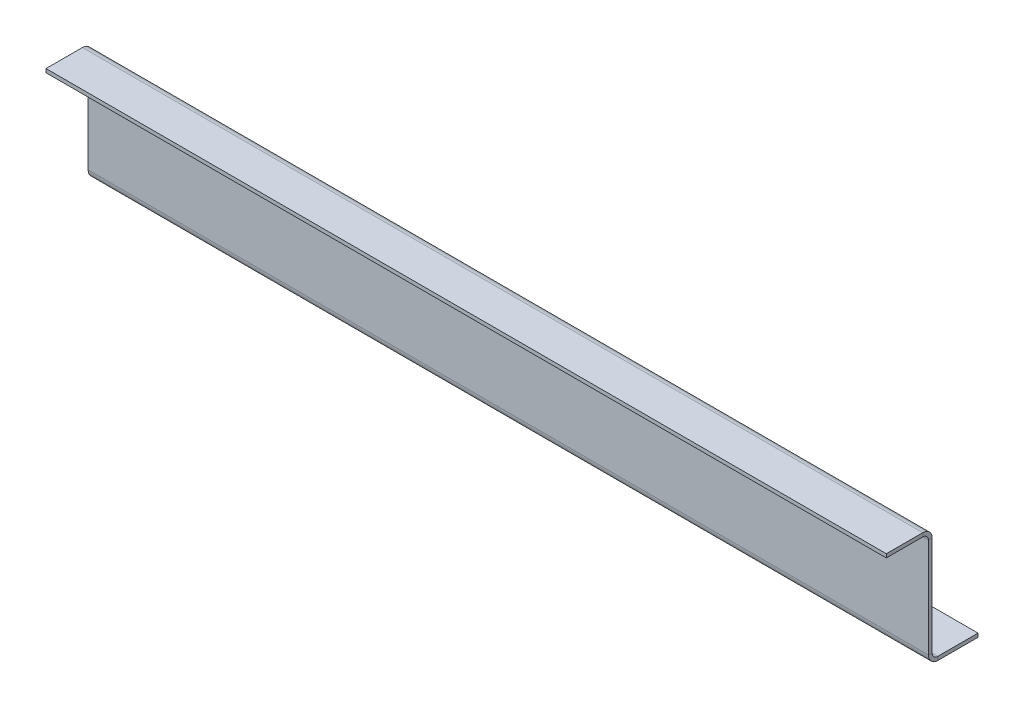
ISO-10303-21;
HEADER;
FILE_DESCRIPTION(('STEP AP214'),'2;1');
FILE_NAME('part.step','',(''),(''),'','','');
FILE_SCHEMA(('AUTOMOTIVE_DESIGN { 1 0 10303 214 1 1 1 1 }'));
ENDSEC;
DATA;
#1=APPLICATION_CONTEXT('core data for automotive mechanical design processes');
#2=APPLICATION_PROTOCOL_DEFINITION('international standard','automotive_design',2000,#1);
#3=PRODUCT_CONTEXT('',#1,'mechanical');
#4=PRODUCT('Part','Part','',(#3));
#5=PRODUCT_RELATED_PRODUCT_CATEGORY('part','',(#4));
#6=PRODUCT_DEFINITION_FORMATION('','',#4);
#7=PRODUCT_DEFINITION_CONTEXT('part definition',#1,'design');
#8=PRODUCT_DEFINITION('design','',#6,#7);
#9=PRODUCT_DEFINITION_SHAPE('','',#8);
#10=(LENGTH_UNIT() NAMED_UNIT(*) SI_UNIT(.MILLI.,.METRE.));
#11=(NAMED_UNIT(*) PLANE_ANGLE_UNIT() SI_UNIT($,.RADIAN.));
#12=(NAMED_UNIT(*) SI_UNIT($,.STERADIAN.) SOLID_ANGLE_UNIT());
#13=UNCERTAINTY_MEASURE_WITH_UNIT(LENGTH_MEASURE(1.E-05),#10,'distance_accuracy_value','');
#14=(GEOMETRIC_REPRESENTATION_CONTEXT(3) GLOBAL_UNCERTAINTY_ASSIGNED_CONTEXT((#13)) GLOBAL_UNIT_ASSIGNED_CONTEXT((#10,
#11,#12)) REPRESENTATION_CONTEXT('',''));
#15=CARTESIAN_POINT('',(0.,0.,0.));
#16=DIRECTION('',(0.,0.,1.));
#17=DIRECTION('',(1.,0.,0.));
#18=AXIS2_PLACEMENT_3D('',#15,#16,#17);
#19=CARTESIAN_POINT('',(279.4,23.0449549544025,0.));
#20=DIRECTION('',(1.,0.,0.));
#21=DIRECTION('',(0.,0.,-1.));
#22=AXIS2_PLACEMENT_3D('',#19,#20,#21);
#23=PLANE('',#22);
#24=DIRECTION('',(0.,0.,1.));
#25=VECTOR('',#24,1.);
#26=CARTESIAN_POINT('',(279.4,23.0449549544025,0.));
#27=LINE('',#26,#25);
#28=CARTESIAN_POINT('',(279.4,23.0449549544025,0.));
#29=VERTEX_POINT('',#28);
#30=CARTESIAN_POINT('',(279.4,23.0449549544025,1.2192));
#31=VERTEX_POINT('',#30);
#32=EDGE_CURVE('E11',#29,#31,#27,.T.);
#33=ORIENTED_EDGE('',*,*,#32,.F.);
#34=CARTESIAN_POINT('',(279.4,23.0449549544025,3.1242));
#35=DIRECTION('',(1.,0.,0.));
#36=DIRECTION('',(0.,0.,-1.));
#37=AXIS2_PLACEMENT_3D('',#34,#35,#36);
#38=CIRCLE('',#37,3.1242);
#39=CARTESIAN_POINT('',(279.4,26.1691549544025,3.12420000000001));
#40=VERTEX_POINT('',#39);
#41=EDGE_CURVE('E249',#40,#29,#38,.F.);
#42=ORIENTED_EDGE('',*,*,#41,.F.);
#43=DIRECTION('',(0.,1.,0.));
#44=VECTOR('',#43,1.);
#45=CARTESIAN_POINT('',(279.4,24.9499549544025,3.12420000000001));
#46=LINE('',#45,#44);
#47=CARTESIAN_POINT('',(279.4,24.9499549544025,3.12420000000001));
#48=VERTEX_POINT('',#47);
#49=EDGE_CURVE('E47',#48,#40,#46,.T.);
#50=ORIENTED_EDGE('',*,*,#49,.F.);
#51=CARTESIAN_POINT('',(279.4,23.0449549544025,3.1242));
#52=DIRECTION('',(1.,0.,0.));
#53=DIRECTION('',(0.,0.,-1.));
#54=AXIS2_PLACEMENT_3D('',#51,#52,#53);
#55=CIRCLE('',#54,1.905);
#56=EDGE_CURVE('E148',#48,#31,#55,.F.);
#57=ORIENTED_EDGE('',*,*,#56,.T.);
#58=EDGE_LOOP('',(#33,#42,#50,#57));
#59=FACE_BOUND('',#58,.T.);
#60=ADVANCED_FACE('F39',(#59),#23,.T.);
#61=CARTESIAN_POINT('',(279.4,24.9499549544025,3.12420000000001));
#62=DIRECTION('',(1.,0.,0.));
#63=DIRECTION('',(0.,0.,-1.));
#64=AXIS2_PLACEMENT_3D('',#61,#62,#63);
#65=PLANE('',#64);
#66=DIRECTION('',(0.,-1.,0.));
#67=VECTOR('',#66,1.);
#68=CARTESIAN_POINT('',(279.4,26.1691549544025,0.));
#69=LINE('',#68,#67);
#70=CARTESIAN_POINT('',(279.4,-10.0258450455975,0.));
#71=VERTEX_POINT('',#70);
#72=EDGE_CURVE('E142',#29,#71,#69,.T.);
#73=ORIENTED_EDGE('',*,*,#72,.F.);
#74=ORIENTED_EDGE('',*,*,#32,.T.);
#75=DIRECTION('',(0.,-1.,0.));
#76=VECTOR('',#75,1.);
#77=CARTESIAN_POINT('',(279.4,26.1691549544025,1.2192));
#78=LINE('',#77,#76);
#79=CARTESIAN_POINT('',(279.4,-10.0258450455974,1.2192));
#80=VERTEX_POINT('',#79);
#81=EDGE_CURVE('E139',#31,#80,#78,.T.);
#82=ORIENTED_EDGE('',*,*,#81,.T.);
#83=DIRECTION('',(0.,0.,-1.));
#84=VECTOR('',#83,1.);
#85=CARTESIAN_POINT('',(279.4,-10.0258450455974,1.2192));
#86=LINE('',#85,#84);
#87=EDGE_CURVE('E230',#80,#71,#86,.T.);
#88=ORIENTED_EDGE('',*,*,#87,.T.);
#89=EDGE_LOOP('',(#73,#74,#82,#88));
#90=FACE_BOUND('',#89,.T.);
#91=ADVANCED_FACE('F137',(#90),#65,.T.);
#92=CARTESIAN_POINT('',(0.,26.1691549544025,3.12420000000001));
#93=DIRECTION('',(-1.,0.,0.));
#94=DIRECTION('',(0.,0.,1.));
#95=AXIS2_PLACEMENT_3D('',#92,#93,#94);
#96=PLANE('',#95);
#97=DIRECTION('',(0.,-1.,0.));
#98=VECTOR('',#97,1.);
#99=CARTESIAN_POINT('',(0.,26.1691549544025,3.12420000000001));
#100=LINE('',#99,#98);
#101=CARTESIAN_POINT('',(0.,26.1691549544025,3.12420000000001));
#102=VERTEX_POINT('',#101);
#103=CARTESIAN_POINT('',(0.,24.9499549544025,3.12420000000001));
#104=VERTEX_POINT('',#103);
#105=EDGE_CURVE('E235',#102,#104,#100,.T.);
#106=ORIENTED_EDGE('',*,*,#105,.F.);
#107=CARTESIAN_POINT('',(0.,23.0449549544025,3.1242));
#108=DIRECTION('',(1.,0.,0.));
#109=DIRECTION('',(0.,0.,-1.));
#110=AXIS2_PLACEMENT_3D('',#107,#108,#109);
#111=CIRCLE('',#110,3.1242);
#112=CARTESIAN_POINT('',(0.,23.0449549544025,0.));
#113=VERTEX_POINT('',#112);
#114=EDGE_CURVE('E187',#102,#113,#111,.F.);
#115=ORIENTED_EDGE('',*,*,#114,.T.);
#116=DIRECTION('',(0.,0.,-1.));
#117=VECTOR('',#116,1.);
#118=CARTESIAN_POINT('',(0.,23.0449549544025,1.2192));
#119=LINE('',#118,#117);
#120=CARTESIAN_POINT('',(0.,23.0449549544025,1.2192));
#121=VERTEX_POINT('',#120);
#122=EDGE_CURVE('E233',#121,#113,#119,.T.);
#123=ORIENTED_EDGE('',*,*,#122,.F.);
#124=CARTESIAN_POINT('',(0.,23.0449549544025,3.1242));
#125=DIRECTION('',(1.,0.,0.));
#126=DIRECTION('',(0.,0.,-1.));
#127=AXIS2_PLACEMENT_3D('',#124,#125,#126);
#128=CIRCLE('',#127,1.905);
#129=EDGE_CURVE('E160',#104,#121,#128,.F.);
#130=ORIENTED_EDGE('',*,*,#129,.F.);
#131=EDGE_LOOP('',(#106,#115,#123,#130));
#132=FACE_BOUND('',#131,.T.);
#133=ADVANCED_FACE('F287',(#132),#96,.T.);
#134=CARTESIAN_POINT('',(0.,23.0449549544025,1.2192));
#135=DIRECTION('',(-1.,0.,0.));
#136=DIRECTION('',(0.,0.,1.));
#137=AXIS2_PLACEMENT_3D('',#134,#135,#136);
#138=PLANE('',#137);
#139=DIRECTION('',(0.,0.,-1.));
#140=VECTOR('',#139,1.);
#141=CARTESIAN_POINT('',(0.,26.1691549544025,15.24));
#142=LINE('',#141,#140);
#143=CARTESIAN_POINT('',(0.,26.1691549544025,15.24));
#144=VERTEX_POINT('',#143);
#145=EDGE_CURVE('E190',#144,#102,#142,.T.);
#146=ORIENTED_EDGE('',*,*,#145,.T.);
#147=ORIENTED_EDGE('',*,*,#105,.T.);
#148=DIRECTION('',(0.,0.,-1.));
#149=VECTOR('',#148,1.);
#150=CARTESIAN_POINT('',(0.,24.9499549544025,15.24));
#151=LINE('',#150,#149);
#152=CARTESIAN_POINT('',(0.,24.9499549544025,15.24));
#153=VERTEX_POINT('',#152);
#154=EDGE_CURVE('E196',#153,#104,#151,.T.);
#155=ORIENTED_EDGE('',*,*,#154,.F.);
#156=DIRECTION('',(0.,1.,0.));
#157=VECTOR('',#156,1.);
#158=CARTESIAN_POINT('',(0.,24.9499549544025,15.24));
#159=LINE('',#158,#157);
#160=EDGE_CURVE('E193',#153,#144,#159,.T.);
#161=ORIENTED_EDGE('',*,*,#160,.T.);
#162=EDGE_LOOP('',(#146,#147,#155,#161));
#163=FACE_BOUND('',#162,.T.);
#164=ADVANCED_FACE('F290',(#163),#138,.T.);
#165=CARTESIAN_POINT('',(279.4,-11.9308450455975,-1.905));
#166=DIRECTION('',(1.,0.,0.));
#167=DIRECTION('',(0.,0.,-1.));
#168=AXIS2_PLACEMENT_3D('',#165,#166,#167);
#169=PLANE('',#168);
#170=DIRECTION('',(0.,-1.,0.));
#171=VECTOR('',#170,1.);
#172=CARTESIAN_POINT('',(279.4,-11.9308450455975,-1.905));
#173=LINE('',#172,#171);
#174=CARTESIAN_POINT('',(279.4,-11.9308450455975,-1.905));
#175=VERTEX_POINT('',#174);
#176=CARTESIAN_POINT('',(279.4,-13.1500450455975,-1.905));
#177=VERTEX_POINT('',#176);
#178=EDGE_CURVE('E55',#175,#177,#173,.T.);
#179=ORIENTED_EDGE('',*,*,#178,.F.);
#180=CARTESIAN_POINT('',(279.4,-10.0258450455975,-1.905));
#181=DIRECTION('',(-1.,0.,0.));
#182=DIRECTION('',(0.,0.,1.));
#183=AXIS2_PLACEMENT_3D('',#180,#181,#182);
#184=CIRCLE('',#183,1.905);
#185=EDGE_CURVE('E259',#71,#175,#184,.F.);
#186=ORIENTED_EDGE('',*,*,#185,.F.);
#187=ORIENTED_EDGE('',*,*,#87,.F.);
#188=CARTESIAN_POINT('',(279.4,-10.0258450455975,-1.905));
#189=DIRECTION('',(1.,0.,0.));
#190=DIRECTION('',(0.,0.,-1.));
#191=AXIS2_PLACEMENT_3D('',#188,#189,#190);
#192=CIRCLE('',#191,3.1242);
#193=EDGE_CURVE('E168',#80,#177,#192,.T.);
#194=ORIENTED_EDGE('',*,*,#193,.T.);
#195=EDGE_LOOP('',(#179,#186,#187,#194));
#196=FACE_BOUND('',#195,.T.);
#197=ADVANCED_FACE('F282',(#196),#169,.T.);
#198=CARTESIAN_POINT('',(279.4,-10.0258450455974,1.2192));
#199=DIRECTION('',(1.,0.,0.));
#200=DIRECTION('',(0.,0.,-1.));
#201=AXIS2_PLACEMENT_3D('',#198,#199,#200);
#202=PLANE('',#201);
#203=DIRECTION('',(0.,0.,-1.));
#204=VECTOR('',#203,1.);
#205=CARTESIAN_POINT('',(279.4,-11.9308450455975,0.));
#206=LINE('',#205,#204);
#207=CARTESIAN_POINT('',(279.4,-11.9308450455975,-15.24));
#208=VERTEX_POINT('',#207);
#209=EDGE_CURVE('E262',#175,#208,#206,.T.);
#210=ORIENTED_EDGE('',*,*,#209,.F.);
#211=ORIENTED_EDGE('',*,*,#178,.T.);
#212=DIRECTION('',(0.,0.,-1.));
#213=VECTOR('',#212,1.);
#214=CARTESIAN_POINT('',(279.4,-13.1500450455975,0.));
#215=LINE('',#214,#213);
#216=CARTESIAN_POINT('',(279.4,-13.1500450455975,-15.24));
#217=VERTEX_POINT('',#216);
#218=EDGE_CURVE('E109',#177,#217,#215,.T.);
#219=ORIENTED_EDGE('',*,*,#218,.T.);
#220=DIRECTION('',(0.,-1.,0.));
#221=VECTOR('',#220,1.);
#222=CARTESIAN_POINT('',(279.4,-11.9308450455975,-15.24));
#223=LINE('',#222,#221);
#224=EDGE_CURVE('E265',#208,#217,#223,.T.);
#225=ORIENTED_EDGE('',*,*,#224,.F.);
#226=EDGE_LOOP('',(#210,#211,#219,#225));
#227=FACE_BOUND('',#226,.T.);
#228=ADVANCED_FACE('F271',(#227),#202,.T.);
#229=CARTESIAN_POINT('',(0.,-10.0258450455975,0.));
#230=DIRECTION('',(-1.,0.,0.));
#231=DIRECTION('',(0.,0.,1.));
#232=AXIS2_PLACEMENT_3D('',#229,#230,#231);
#233=PLANE('',#232);
#234=DIRECTION('',(0.,0.,1.));
#235=VECTOR('',#234,1.);
#236=CARTESIAN_POINT('',(0.,-10.0258450455975,0.));
#237=LINE('',#236,#235);
#238=CARTESIAN_POINT('',(0.,-10.0258450455975,0.));
#239=VERTEX_POINT('',#238);
#240=CARTESIAN_POINT('',(0.,-10.0258450455974,1.2192));
#241=VERTEX_POINT('',#240);
#242=EDGE_CURVE('E96',#239,#241,#237,.T.);
#243=ORIENTED_EDGE('',*,*,#242,.F.);
#244=CARTESIAN_POINT('',(0.,-10.0258450455975,-1.905));
#245=DIRECTION('',(-1.,0.,0.));
#246=DIRECTION('',(0.,0.,1.));
#247=AXIS2_PLACEMENT_3D('',#244,#245,#246);
#248=CIRCLE('',#247,1.905);
#249=CARTESIAN_POINT('',(0.,-11.9308450455975,-1.905));
#250=VERTEX_POINT('',#249);
#251=EDGE_CURVE('E183',#239,#250,#248,.F.);
#252=ORIENTED_EDGE('',*,*,#251,.T.);
#253=DIRECTION('',(0.,1.,0.));
#254=VECTOR('',#253,1.);
#255=CARTESIAN_POINT('',(0.,-13.1500450455975,-1.905));
#256=LINE('',#255,#254);
#257=CARTESIAN_POINT('',(0.,-13.1500450455975,-1.905));
#258=VERTEX_POINT('',#257);
#259=EDGE_CURVE('E103',#258,#250,#256,.T.);
#260=ORIENTED_EDGE('',*,*,#259,.F.);
#261=CARTESIAN_POINT('',(0.,-10.0258450455975,-1.905));
#262=DIRECTION('',(1.,0.,0.));
#263=DIRECTION('',(0.,0.,-1.));
#264=AXIS2_PLACEMENT_3D('',#261,#262,#263);
#265=CIRCLE('',#264,3.1242);
#266=EDGE_CURVE('E202',#241,#258,#265,.T.);
#267=ORIENTED_EDGE('',*,*,#266,.F.);
#268=EDGE_LOOP('',(#243,#252,#260,#267));
#269=FACE_BOUND('',#268,.T.);
#270=ADVANCED_FACE('F319',(#269),#233,.T.);
#271=CARTESIAN_POINT('',(0.,-13.1500450455975,-1.905));
#272=DIRECTION('',(-1.,0.,0.));
#273=DIRECTION('',(0.,0.,1.));
#274=AXIS2_PLACEMENT_3D('',#271,#272,#273);
#275=PLANE('',#274);
#276=DIRECTION('',(0.,-1.,0.));
#277=VECTOR('',#276,1.);
#278=CARTESIAN_POINT('',(0.,26.1691549544025,0.));
#279=LINE('',#278,#277);
#280=EDGE_CURVE('E185',#113,#239,#279,.T.);
#281=ORIENTED_EDGE('',*,*,#280,.T.);
#282=ORIENTED_EDGE('',*,*,#242,.T.);
#283=DIRECTION('',(0.,-1.,0.));
#284=VECTOR('',#283,1.);
#285=CARTESIAN_POINT('',(0.,26.1691549544025,1.2192));
#286=LINE('',#285,#284);
#287=EDGE_CURVE('E200',#121,#241,#286,.T.);
#288=ORIENTED_EDGE('',*,*,#287,.F.);
#289=ORIENTED_EDGE('',*,*,#122,.T.);
#290=EDGE_LOOP('',(#281,#282,#288,#289));
#291=FACE_BOUND('',#290,.T.);
#292=ADVANCED_FACE('F322',(#291),#275,.T.);
#293=CARTESIAN_POINT('',(279.4,-13.1500450455975,0.));
#294=DIRECTION('',(0.,1.,0.));
#295=DIRECTION('',(0.,0.,1.));
#296=AXIS2_PLACEMENT_3D('',#293,#294,#295);
#297=PLANE('',#296);
#298=DIRECTION('',(0.,0.,-1.));
#299=VECTOR('',#298,1.);
#300=CARTESIAN_POINT('',(0.,-13.1500450455975,0.));
#301=LINE('',#300,#299);
#302=CARTESIAN_POINT('',(0.,-13.1500450455975,-15.24));
#303=VERTEX_POINT('',#302);
#304=EDGE_CURVE('E174',#258,#303,#301,.T.);
#305=ORIENTED_EDGE('',*,*,#304,.T.);
#306=DIRECTION('',(-1.,0.,0.));
#307=VECTOR('',#306,1.);
#308=CARTESIAN_POINT('',(279.4,-13.1500450455975,-15.24));
#309=LINE('',#308,#307);
#310=EDGE_CURVE('E226',#217,#303,#309,.T.);
#311=ORIENTED_EDGE('',*,*,#310,.F.);
#312=ORIENTED_EDGE('',*,*,#218,.F.);
#313=DIRECTION('',(-1.,0.,0.));
#314=VECTOR('',#313,1.);
#315=CARTESIAN_POINT('',(279.4,-13.1500450455975,-1.905));
#316=LINE('',#315,#314);
#317=EDGE_CURVE('E170',#177,#258,#316,.T.);
#318=ORIENTED_EDGE('',*,*,#317,.T.);
#319=EDGE_LOOP('',(#305,#311,#312,#318));
#320=FACE_BOUND('',#319,.T.);
#321=ADVANCED_FACE('F325',(#320),#297,.F.);
#322=CARTESIAN_POINT('',(279.4,-11.9308450455975,-15.24));
#323=DIRECTION('',(0.,0.,-1.));
#324=DIRECTION('',(-1.,0.,0.));
#325=AXIS2_PLACEMENT_3D('',#322,#323,#324);
#326=PLANE('',#325);
#327=DIRECTION('',(0.,-1.,0.));
#328=VECTOR('',#327,1.);
#329=CARTESIAN_POINT('',(0.,-11.9308450455975,-15.24));
#330=LINE('',#329,#328);
#331=CARTESIAN_POINT('',(0.,-11.9308450455975,-15.24));
#332=VERTEX_POINT('',#331);
#333=EDGE_CURVE('E177',#332,#303,#330,.T.);
#334=ORIENTED_EDGE('',*,*,#333,.F.);
#335=DIRECTION('',(-1.,0.,0.));
#336=VECTOR('',#335,1.);
#337=CARTESIAN_POINT('',(279.4,-11.9308450455975,-15.24));
#338=LINE('',#337,#336);
#339=EDGE_CURVE('E224',#208,#332,#338,.T.);
#340=ORIENTED_EDGE('',*,*,#339,.F.);
#341=ORIENTED_EDGE('',*,*,#224,.T.);
#342=ORIENTED_EDGE('',*,*,#310,.T.);
#343=EDGE_LOOP('',(#334,#340,#341,#342));
#344=FACE_BOUND('',#343,.T.);
#345=ADVANCED_FACE('F270',(#344),#326,.T.);
#346=CARTESIAN_POINT('',(279.4,-11.9308450455975,0.));
#347=DIRECTION('',(0.,1.,0.));
#348=DIRECTION('',(0.,0.,1.));
#349=AXIS2_PLACEMENT_3D('',#346,#347,#348);
#350=PLANE('',#349);
#351=DIRECTION('',(0.,0.,-1.));
#352=VECTOR('',#351,1.);
#353=CARTESIAN_POINT('',(0.,-11.9308450455975,0.));
#354=LINE('',#353,#352);
#355=EDGE_CURVE('E180',#250,#332,#354,.T.);
#356=ORIENTED_EDGE('',*,*,#355,.F.);
#357=DIRECTION('',(-1.,0.,0.));
#358=VECTOR('',#357,1.);
#359=CARTESIAN_POINT('',(279.4,-11.9308450455975,-1.905));
#360=LINE('',#359,#358);
#361=EDGE_CURVE('E221',#175,#250,#360,.T.);
#362=ORIENTED_EDGE('',*,*,#361,.F.);
#363=ORIENTED_EDGE('',*,*,#209,.T.);
#364=ORIENTED_EDGE('',*,*,#339,.T.);
#365=EDGE_LOOP('',(#356,#362,#363,#364));
#366=FACE_BOUND('',#365,.T.);
#367=ADVANCED_FACE('F275',(#366),#350,.T.);
#368=CARTESIAN_POINT('',(279.4,-10.0258450455975,-1.905));
#369=DIRECTION('',(-1.,0.,0.));
#370=DIRECTION('',(0.,0.,1.));
#371=AXIS2_PLACEMENT_3D('',#368,#369,#370);
#372=CYLINDRICAL_SURFACE('',#371,1.905);
#373=ORIENTED_EDGE('',*,*,#251,.F.);
#374=DIRECTION('',(-1.,0.,0.));
#375=VECTOR('',#374,1.);
#376=CARTESIAN_POINT('',(279.4,-10.0258450455975,0.));
#377=LINE('',#376,#375);
#378=EDGE_CURVE('E218',#71,#239,#377,.T.);
#379=ORIENTED_EDGE('',*,*,#378,.F.);
#380=ORIENTED_EDGE('',*,*,#185,.T.);
#381=ORIENTED_EDGE('',*,*,#361,.T.);
#382=EDGE_LOOP('',(#373,#379,#380,#381));
#383=FACE_BOUND('',#382,.T.);
#384=ADVANCED_FACE('F278',(#383),#372,.F.);
#385=CARTESIAN_POINT('',(279.4,26.1691549544025,0.));
#386=DIRECTION('',(0.,0.,-1.));
#387=DIRECTION('',(0.,1.,0.));
#388=AXIS2_PLACEMENT_3D('',#385,#386,#387);
#389=PLANE('',#388);
#390=ORIENTED_EDGE('',*,*,#280,.F.);
#391=DIRECTION('',(-1.,0.,0.));
#392=VECTOR('',#391,1.);
#393=CARTESIAN_POINT('',(279.4,23.0449549544025,0.));
#394=LINE('',#393,#392);
#395=EDGE_CURVE('E215',#29,#113,#394,.T.);
#396=ORIENTED_EDGE('',*,*,#395,.F.);
#397=ORIENTED_EDGE('',*,*,#72,.T.);
#398=ORIENTED_EDGE('',*,*,#378,.T.);
#399=EDGE_LOOP('',(#390,#396,#397,#398));
#400=FACE_BOUND('',#399,.T.);
#401=ADVANCED_FACE('F285',(#400),#389,.T.);
#402=CARTESIAN_POINT('',(279.4,23.0449549544025,3.1242));
#403=DIRECTION('',(-1.,0.,0.));
#404=DIRECTION('',(0.,0.,1.));
#405=AXIS2_PLACEMENT_3D('',#402,#403,#404);
#406=CYLINDRICAL_SURFACE('',#405,3.1242);
#407=ORIENTED_EDGE('',*,*,#114,.F.);
#408=DIRECTION('',(-1.,0.,0.));
#409=VECTOR('',#408,1.);
#410=CARTESIAN_POINT('',(279.4,26.1691549544025,3.12420000000001));
#411=LINE('',#410,#409);
#412=EDGE_CURVE('E212',#40,#102,#411,.T.);
#413=ORIENTED_EDGE('',*,*,#412,.F.);
#414=ORIENTED_EDGE('',*,*,#41,.T.);
#415=ORIENTED_EDGE('',*,*,#395,.T.);
#416=EDGE_LOOP('',(#407,#413,#414,#415));
#417=FACE_BOUND('',#416,.T.);
#418=ADVANCED_FACE('F248',(#417),#406,.T.);
#419=CARTESIAN_POINT('',(279.4,26.1691549544025,15.24));
#420=DIRECTION('',(0.,1.,0.));
#421=DIRECTION('',(0.,0.,1.));
#422=AXIS2_PLACEMENT_3D('',#419,#420,#421);
#423=PLANE('',#422);
#424=ORIENTED_EDGE('',*,*,#145,.F.);
#425=DIRECTION('',(-1.,0.,0.));
#426=VECTOR('',#425,1.);
#427=CARTESIAN_POINT('',(279.4,26.1691549544025,15.24));
#428=LINE('',#427,#426);
#429=CARTESIAN_POINT('',(279.4,26.1691549544025,15.24));
#430=VERTEX_POINT('',#429);
#431=EDGE_CURVE('E210',#430,#144,#428,.T.);
#432=ORIENTED_EDGE('',*,*,#431,.F.);
#433=DIRECTION('',(0.,0.,-1.));
#434=VECTOR('',#433,1.);
#435=CARTESIAN_POINT('',(279.4,26.1691549544025,15.24));
#436=LINE('',#435,#434);
#437=EDGE_CURVE('E242',#430,#40,#436,.T.);
#438=ORIENTED_EDGE('',*,*,#437,.T.);
#439=ORIENTED_EDGE('',*,*,#412,.T.);
#440=EDGE_LOOP('',(#424,#432,#438,#439));
#441=FACE_BOUND('',#440,.T.);
#442=ADVANCED_FACE('F253',(#441),#423,.T.);
#443=CARTESIAN_POINT('',(279.4,24.9499549544025,15.24));
#444=DIRECTION('',(0.,0.,1.));
#445=DIRECTION('',(1.,0.,0.));
#446=AXIS2_PLACEMENT_3D('',#443,#444,#445);
#447=PLANE('',#446);
#448=ORIENTED_EDGE('',*,*,#160,.F.);
#449=DIRECTION('',(-1.,0.,0.));
#450=VECTOR('',#449,1.);
#451=CARTESIAN_POINT('',(279.4,24.9499549544025,15.24));
#452=LINE('',#451,#450);
#453=CARTESIAN_POINT('',(279.4,24.9499549544025,15.24));
#454=VERTEX_POINT('',#453);
#455=EDGE_CURVE('E208',#454,#153,#452,.T.);
#456=ORIENTED_EDGE('',*,*,#455,.F.);
#457=DIRECTION('',(0.,1.,0.));
#458=VECTOR('',#457,1.);
#459=CARTESIAN_POINT('',(279.4,24.9499549544025,15.24));
#460=LINE('',#459,#458);
#461=EDGE_CURVE('E254',#454,#430,#460,.T.);
#462=ORIENTED_EDGE('',*,*,#461,.T.);
#463=ORIENTED_EDGE('',*,*,#431,.T.);
#464=EDGE_LOOP('',(#448,#456,#462,#463));
#465=FACE_BOUND('',#464,.T.);
#466=ADVANCED_FACE('F295',(#465),#447,.T.);
#467=CARTESIAN_POINT('',(279.4,24.9499549544025,15.24));
#468=DIRECTION('',(0.,1.,0.));
#469=DIRECTION('',(0.,0.,1.));
#470=AXIS2_PLACEMENT_3D('',#467,#468,#469);
#471=PLANE('',#470);
#472=ORIENTED_EDGE('',*,*,#154,.T.);
#473=DIRECTION('',(-1.,0.,0.));
#474=VECTOR('',#473,1.);
#475=CARTESIAN_POINT('',(279.4,24.9499549544025,3.12420000000001));
#476=LINE('',#475,#474);
#477=EDGE_CURVE('E162',#48,#104,#476,.T.);
#478=ORIENTED_EDGE('',*,*,#477,.F.);
#479=DIRECTION('',(0.,0.,-1.));
#480=VECTOR('',#479,1.);
#481=CARTESIAN_POINT('',(279.4,24.9499549544025,15.24));
#482=LINE('',#481,#480);
#483=EDGE_CURVE('E153',#454,#48,#482,.T.);
#484=ORIENTED_EDGE('',*,*,#483,.F.);
#485=ORIENTED_EDGE('',*,*,#455,.T.);
#486=EDGE_LOOP('',(#472,#478,#484,#485));
#487=FACE_BOUND('',#486,.T.);
#488=ADVANCED_FACE('F293',(#487),#471,.F.);
#489=CARTESIAN_POINT('',(279.4,23.0449549544025,3.1242));
#490=DIRECTION('',(-1.,0.,0.));
#491=DIRECTION('',(0.,0.,1.));
#492=AXIS2_PLACEMENT_3D('',#489,#490,#491);
#493=CYLINDRICAL_SURFACE('',#492,1.905);
#494=ORIENTED_EDGE('',*,*,#129,.T.);
#495=DIRECTION('',(-1.,0.,0.));
#496=VECTOR('',#495,1.);
#497=CARTESIAN_POINT('',(279.4,23.0449549544025,1.2192));
#498=LINE('',#497,#496);
#499=EDGE_CURVE('E157',#31,#121,#498,.T.);
#500=ORIENTED_EDGE('',*,*,#499,.F.);
#501=ORIENTED_EDGE('',*,*,#56,.F.);
#502=ORIENTED_EDGE('',*,*,#477,.T.);
#503=EDGE_LOOP('',(#494,#500,#501,#502));
#504=FACE_BOUND('',#503,.T.);
#505=ADVANCED_FACE('F158',(#504),#493,.F.);
#506=CARTESIAN_POINT('',(279.4,26.1691549544025,1.2192));
#507=DIRECTION('',(0.,0.,-1.));
#508=DIRECTION('',(0.,1.,0.));
#509=AXIS2_PLACEMENT_3D('',#506,#507,#508);
#510=PLANE('',#509);
#511=ORIENTED_EDGE('',*,*,#287,.T.);
#512=DIRECTION('',(-1.,0.,0.));
#513=VECTOR('',#512,1.);
#514=CARTESIAN_POINT('',(279.4,-10.0258450455974,1.2192));
#515=LINE('',#514,#513);
#516=EDGE_CURVE('E163',#80,#241,#515,.T.);
#517=ORIENTED_EDGE('',*,*,#516,.F.);
#518=ORIENTED_EDGE('',*,*,#81,.F.);
#519=ORIENTED_EDGE('',*,*,#499,.T.);
#520=EDGE_LOOP('',(#511,#517,#518,#519));
#521=FACE_BOUND('',#520,.T.);
#522=ADVANCED_FACE('F165',(#521),#510,.F.);
#523=CARTESIAN_POINT('',(279.4,-10.0258450455975,-1.905));
#524=DIRECTION('',(-1.,0.,0.));
#525=DIRECTION('',(0.,0.,1.));
#526=AXIS2_PLACEMENT_3D('',#523,#524,#525);
#527=CYLINDRICAL_SURFACE('',#526,3.1242);
#528=ORIENTED_EDGE('',*,*,#266,.T.);
#529=ORIENTED_EDGE('',*,*,#317,.F.);
#530=ORIENTED_EDGE('',*,*,#193,.F.);
#531=ORIENTED_EDGE('',*,*,#516,.T.);
#532=EDGE_LOOP('',(#528,#529,#530,#531));
#533=FACE_BOUND('',#532,.T.);
#534=ADVANCED_FACE('F377',(#533),#527,.T.);
#535=CARTESIAN_POINT('',(279.4,-10.0258450455975,-1.905));
#536=DIRECTION('',(-1.,0.,0.));
#537=DIRECTION('',(0.,0.,1.));
#538=AXIS2_PLACEMENT_3D('',#535,#536,#537);
#539=PLANE('',#538);
#540=ORIENTED_EDGE('',*,*,#483,.T.);
#541=ORIENTED_EDGE('',*,*,#49,.T.);
#542=ORIENTED_EDGE('',*,*,#437,.F.);
#543=ORIENTED_EDGE('',*,*,#461,.F.);
#544=EDGE_LOOP('',(#540,#541,#542,#543));
#545=FACE_BOUND('',#544,.T.);
#546=ADVANCED_FACE('F239',(#545),#539,.F.);
#547=CARTESIAN_POINT('',(0.,-10.0258450455975,-1.905));
#548=DIRECTION('',(-1.,0.,0.));
#549=DIRECTION('',(0.,0.,1.));
#550=AXIS2_PLACEMENT_3D('',#547,#548,#549);
#551=PLANE('',#550);
#552=ORIENTED_EDGE('',*,*,#304,.F.);
#553=ORIENTED_EDGE('',*,*,#259,.T.);
#554=ORIENTED_EDGE('',*,*,#355,.T.);
#555=ORIENTED_EDGE('',*,*,#333,.T.);
#556=EDGE_LOOP('',(#552,#553,#554,#555));
#557=FACE_BOUND('',#556,.T.);
#558=ADVANCED_FACE('F397',(#557),#551,.T.);
#559=CLOSED_SHELL('',(#60,#91,#133,#164,#197,#228,#270,#292,#321,#345,#367,#384,#401,#418,#442,
#466,#488,#505,#522,#534,#546,#558));
#560=MANIFOLD_SOLID_BREP('B2',#559);
#561=ADVANCED_BREP_SHAPE_REPRESENTATION('',(#18,#560),#14);
#562=SHAPE_DEFINITION_REPRESENTATION(#9,#561);
ENDSEC;
END-ISO-10303-21;
